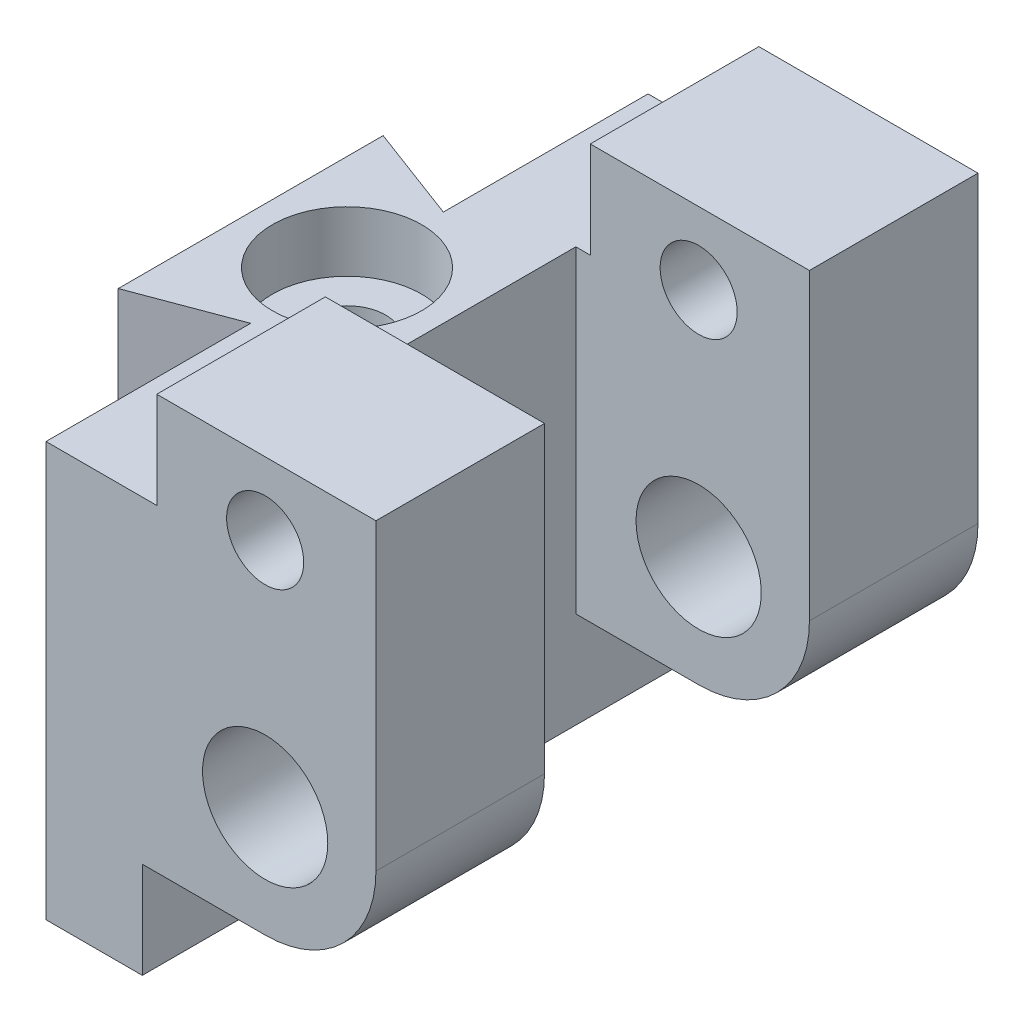
ISO-10303-21;
HEADER;
FILE_DESCRIPTION(('STEP AP214'),'2;1');
FILE_NAME('part.step','',(''),(''),'','','');
FILE_SCHEMA(('AUTOMOTIVE_DESIGN { 1 0 10303 214 1 1 1 1 }'));
ENDSEC;
DATA;
#1=APPLICATION_CONTEXT('core data for automotive mechanical design processes');
#2=APPLICATION_PROTOCOL_DEFINITION('international standard','automotive_design',2000,#1);
#3=PRODUCT_CONTEXT('',#1,'mechanical');
#4=PRODUCT('Part','Part','',(#3));
#5=PRODUCT_RELATED_PRODUCT_CATEGORY('part','',(#4));
#6=PRODUCT_DEFINITION_FORMATION('','',#4);
#7=PRODUCT_DEFINITION_CONTEXT('part definition',#1,'design');
#8=PRODUCT_DEFINITION('design','',#6,#7);
#9=PRODUCT_DEFINITION_SHAPE('','',#8);
#10=(LENGTH_UNIT() NAMED_UNIT(*) SI_UNIT(.MILLI.,.METRE.));
#11=(NAMED_UNIT(*) PLANE_ANGLE_UNIT() SI_UNIT($,.RADIAN.));
#12=(NAMED_UNIT(*) SI_UNIT($,.STERADIAN.) SOLID_ANGLE_UNIT());
#13=UNCERTAINTY_MEASURE_WITH_UNIT(LENGTH_MEASURE(1.E-05),#10,'distance_accuracy_value','');
#14=(GEOMETRIC_REPRESENTATION_CONTEXT(3) GLOBAL_UNCERTAINTY_ASSIGNED_CONTEXT((#13)) GLOBAL_UNIT_ASSIGNED_CONTEXT((#10,
#11,#12)) REPRESENTATION_CONTEXT('',''));
#15=CARTESIAN_POINT('',(0.,0.,0.));
#16=DIRECTION('',(0.,0.,1.));
#17=DIRECTION('',(1.,0.,0.));
#18=AXIS2_PLACEMENT_3D('',#15,#16,#17);
#19=CARTESIAN_POINT('',(-9.10000000000002,25.65,12.5));
#20=DIRECTION('',(0.,-1.,0.));
#21=DIRECTION('',(1.,0.,0.));
#22=AXIS2_PLACEMENT_3D('',#19,#20,#21);
#23=CYLINDRICAL_SURFACE('',#22,1.6);
#24=CARTESIAN_POINT('',(-9.10000000000001,0.649999999999994,12.5));
#25=DIRECTION('',(0.,1.,0.));
#26=DIRECTION('',(-1.,0.,0.));
#27=AXIS2_PLACEMENT_3D('',#24,#25,#26);
#28=CIRCLE('',#27,1.6);
#29=CARTESIAN_POINT('',(-10.7,0.649999999999994,12.5));
#30=VERTEX_POINT('',#29);
#31=EDGE_CURVE('E301',#30,#30,#28,.T.);
#32=ORIENTED_EDGE('',*,*,#31,.F.);
#33=EDGE_LOOP('',(#32));
#34=FACE_BOUND('',#33,.T.);
#35=CARTESIAN_POINT('',(-9.10000000000001,6.1,12.5));
#36=DIRECTION('',(0.,1.,0.));
#37=DIRECTION('',(0.,0.,1.));
#38=AXIS2_PLACEMENT_3D('',#35,#36,#37);
#39=CIRCLE('',#38,1.6);
#40=CARTESIAN_POINT('',(-9.10000000000001,6.1,14.1));
#41=VERTEX_POINT('',#40);
#42=EDGE_CURVE('E39',#41,#41,#39,.F.);
#43=ORIENTED_EDGE('',*,*,#42,.F.);
#44=EDGE_LOOP('',(#43));
#45=FACE_BOUND('',#44,.T.);
#46=ADVANCED_FACE('F35',(#34,#45),#23,.F.);
#47=CARTESIAN_POINT('',(4.6,11.6,-15.1211772028503));
#48=DIRECTION('',(1.,0.,0.));
#49=DIRECTION('',(0.,1.,0.));
#50=AXIS2_PLACEMENT_3D('',#47,#48,#49);
#51=PLANE('',#50);
#52=DIRECTION('',(0.,-1.,0.));
#53=VECTOR('',#52,1.);
#54=CARTESIAN_POINT('',(4.6,11.6,0.));
#55=LINE('',#54,#53);
#56=CARTESIAN_POINT('',(4.6,12.6,0.));
#57=VERTEX_POINT('',#56);
#58=CARTESIAN_POINT('',(4.6,0.,0.));
#59=VERTEX_POINT('',#58);
#60=EDGE_CURVE('E274',#57,#59,#55,.T.);
#61=ORIENTED_EDGE('',*,*,#60,.F.);
#62=DIRECTION('',(0.,0.,-1.));
#63=VECTOR('',#62,1.);
#64=CARTESIAN_POINT('',(4.6,12.6,7.));
#65=LINE('',#64,#63);
#66=CARTESIAN_POINT('',(4.6,12.6,7.));
#67=VERTEX_POINT('',#66);
#68=EDGE_CURVE('E231',#67,#57,#65,.T.);
#69=ORIENTED_EDGE('',*,*,#68,.F.);
#70=DIRECTION('',(0.,-1.,0.));
#71=VECTOR('',#70,1.);
#72=CARTESIAN_POINT('',(4.6,11.6,7.));
#73=LINE('',#72,#71);
#74=CARTESIAN_POINT('',(4.6,0.,7.));
#75=VERTEX_POINT('',#74);
#76=EDGE_CURVE('E429',#67,#75,#73,.T.);
#77=ORIENTED_EDGE('',*,*,#76,.T.);
#78=DIRECTION('',(0.,0.,1.));
#79=VECTOR('',#78,1.);
#80=CARTESIAN_POINT('',(4.6,0.,-15.1211772028503));
#81=LINE('',#80,#79);
#82=EDGE_CURVE('E277',#59,#75,#81,.T.);
#83=ORIENTED_EDGE('',*,*,#82,.F.);
#84=EDGE_LOOP('',(#61,#69,#77,#83));
#85=FACE_BOUND('',#84,.T.);
#86=ADVANCED_FACE('F460',(#85),#51,.T.);
#87=CARTESIAN_POINT('',(4.6,0.,18.));
#88=VERTEX_POINT('',#87);
#89=CARTESIAN_POINT('',(4.6,0.,25.));
#90=VERTEX_POINT('',#89);
#91=EDGE_CURVE('E279',#88,#90,#81,.T.);
#92=ORIENTED_EDGE('',*,*,#91,.F.);
#93=DIRECTION('',(0.,1.,0.));
#94=VECTOR('',#93,1.);
#95=CARTESIAN_POINT('',(4.6,11.6,18.));
#96=LINE('',#95,#94);
#97=CARTESIAN_POINT('',(4.6,12.6,18.));
#98=VERTEX_POINT('',#97);
#99=EDGE_CURVE('E421',#88,#98,#96,.T.);
#100=ORIENTED_EDGE('',*,*,#99,.T.);
#101=DIRECTION('',(0.,0.,-1.));
#102=VECTOR('',#101,1.);
#103=CARTESIAN_POINT('',(4.6,12.6,25.));
#104=LINE('',#103,#102);
#105=CARTESIAN_POINT('',(4.6,12.6,25.));
#106=VERTEX_POINT('',#105);
#107=EDGE_CURVE('E245',#106,#98,#104,.T.);
#108=ORIENTED_EDGE('',*,*,#107,.F.);
#109=DIRECTION('',(0.,1.,0.));
#110=VECTOR('',#109,1.);
#111=CARTESIAN_POINT('',(4.6,11.6,25.));
#112=LINE('',#111,#110);
#113=EDGE_CURVE('E273',#90,#106,#112,.T.);
#114=ORIENTED_EDGE('',*,*,#113,.F.);
#115=EDGE_LOOP('',(#92,#100,#108,#114));
#116=FACE_BOUND('',#115,.T.);
#117=ADVANCED_FACE('F498',(#116),#51,.T.);
#118=CARTESIAN_POINT('',(-5.1,8.6,25.));
#119=DIRECTION('',(-1.,0.,0.));
#120=DIRECTION('',(0.,-1.,0.));
#121=AXIS2_PLACEMENT_3D('',#118,#119,#120);
#122=PLANE('',#121);
#123=DIRECTION('',(0.,0.,-1.));
#124=VECTOR('',#123,1.);
#125=CARTESIAN_POINT('',(-5.1,-8.6,25.));
#126=LINE('',#125,#124);
#127=CARTESIAN_POINT('',(-5.1,-8.6,25.));
#128=VERTEX_POINT('',#127);
#129=CARTESIAN_POINT('',(-5.1,-8.6,0.));
#130=VERTEX_POINT('',#129);
#131=EDGE_CURVE('E415',#128,#130,#126,.T.);
#132=ORIENTED_EDGE('',*,*,#131,.T.);
#133=DIRECTION('',(0.,1.,0.));
#134=VECTOR('',#133,1.);
#135=CARTESIAN_POINT('',(-5.1,-4.6,0.));
#136=LINE('',#135,#134);
#137=CARTESIAN_POINT('',(-5.1,-4.6,0.));
#138=VERTEX_POINT('',#137);
#139=EDGE_CURVE('E394',#130,#138,#136,.T.);
#140=ORIENTED_EDGE('',*,*,#139,.T.);
#141=DIRECTION('',(0.,0.,-1.));
#142=VECTOR('',#141,1.);
#143=CARTESIAN_POINT('',(-5.1,-4.6,25.));
#144=LINE('',#143,#142);
#145=CARTESIAN_POINT('',(-5.1,-4.6,7.));
#146=VERTEX_POINT('',#145);
#147=EDGE_CURVE('E411',#146,#138,#144,.T.);
#148=ORIENTED_EDGE('',*,*,#147,.F.);
#149=DIRECTION('',(0.,1.,0.));
#150=VECTOR('',#149,1.);
#151=CARTESIAN_POINT('',(-5.10000000000001,-20.4,7.));
#152=LINE('',#151,#150);
#153=CARTESIAN_POINT('',(-5.1,8.6,7.));
#154=VERTEX_POINT('',#153);
#155=EDGE_CURVE('E349',#146,#154,#152,.T.);
#156=ORIENTED_EDGE('',*,*,#155,.T.);
#157=DIRECTION('',(0.,0.,1.));
#158=VECTOR('',#157,1.);
#159=CARTESIAN_POINT('',(-5.1,8.6,25.));
#160=LINE('',#159,#158);
#161=CARTESIAN_POINT('',(-5.1,8.6,18.));
#162=VERTEX_POINT('',#161);
#163=EDGE_CURVE('E270',#154,#162,#160,.T.);
#164=ORIENTED_EDGE('',*,*,#163,.T.);
#165=DIRECTION('',(0.,1.,0.));
#166=VECTOR('',#165,1.);
#167=CARTESIAN_POINT('',(-5.1,-20.4,18.));
#168=LINE('',#167,#166);
#169=CARTESIAN_POINT('',(-5.1,-4.6,18.));
#170=VERTEX_POINT('',#169);
#171=EDGE_CURVE('E341',#170,#162,#168,.T.);
#172=ORIENTED_EDGE('',*,*,#171,.F.);
#173=CARTESIAN_POINT('',(-5.1,-4.6,25.));
#174=VERTEX_POINT('',#173);
#175=EDGE_CURVE('E412',#174,#170,#144,.T.);
#176=ORIENTED_EDGE('',*,*,#175,.F.);
#177=DIRECTION('',(0.,1.,0.));
#178=VECTOR('',#177,1.);
#179=CARTESIAN_POINT('',(-5.1,-4.6,25.));
#180=LINE('',#179,#178);
#181=EDGE_CURVE('E379',#128,#174,#180,.T.);
#182=ORIENTED_EDGE('',*,*,#181,.F.);
#183=EDGE_LOOP('',(#132,#140,#148,#156,#164,#172,#176,#182));
#184=FACE_BOUND('',#183,.T.);
#185=DIRECTION('',(0.,0.,1.));
#186=VECTOR('',#185,1.);
#187=CARTESIAN_POINT('',(-5.1,-1.85,9.75000000000001));
#188=LINE('',#187,#186);
#189=CARTESIAN_POINT('',(-5.1,-1.85,9.75000000000001));
#190=VERTEX_POINT('',#189);
#191=CARTESIAN_POINT('',(-5.1,-1.85,15.25));
#192=VERTEX_POINT('',#191);
#193=EDGE_CURVE('E324',#190,#192,#188,.T.);
#194=ORIENTED_EDGE('',*,*,#193,.T.);
#195=DIRECTION('',(0.,1.,0.));
#196=VECTOR('',#195,1.);
#197=CARTESIAN_POINT('',(-5.1,-1.85,15.25));
#198=LINE('',#197,#196);
#199=CARTESIAN_POINT('',(-5.10000000000001,0.649999999999996,15.25));
#200=VERTEX_POINT('',#199);
#201=EDGE_CURVE('E327',#192,#200,#198,.T.);
#202=ORIENTED_EDGE('',*,*,#201,.T.);
#203=DIRECTION('',(0.,0.,1.));
#204=VECTOR('',#203,1.);
#205=CARTESIAN_POINT('',(-5.10000000000001,0.649999999999996,9.75000000000001));
#206=LINE('',#205,#204);
#207=CARTESIAN_POINT('',(-5.1,0.649999999999996,9.75));
#208=VERTEX_POINT('',#207);
#209=EDGE_CURVE('E314',#208,#200,#206,.T.);
#210=ORIENTED_EDGE('',*,*,#209,.F.);
#211=DIRECTION('',(0.,1.,0.));
#212=VECTOR('',#211,1.);
#213=CARTESIAN_POINT('',(-5.1,-1.85,9.75000000000001));
#214=LINE('',#213,#212);
#215=EDGE_CURVE('E330',#190,#208,#214,.T.);
#216=ORIENTED_EDGE('',*,*,#215,.F.);
#217=EDGE_LOOP('',(#194,#202,#210,#216));
#218=FACE_BOUND('',#217,.T.);
#219=ADVANCED_FACE('F443',(#184,#218),#122,.F.);
#220=CARTESIAN_POINT('',(-9.1,8.6,25.));
#221=DIRECTION('',(1.,0.,0.));
#222=DIRECTION('',(0.,0.,-1.));
#223=AXIS2_PLACEMENT_3D('',#220,#221,#222);
#224=PLANE('',#223);
#225=DIRECTION('',(0.,1.,0.));
#226=VECTOR('',#225,1.);
#227=CARTESIAN_POINT('',(-9.10000000000001,-17.5442719099992,16.5));
#228=LINE('',#227,#226);
#229=CARTESIAN_POINT('',(-9.1,-8.6,16.5));
#230=VERTEX_POINT('',#229);
#231=CARTESIAN_POINT('',(-9.1,8.6,16.5));
#232=VERTEX_POINT('',#231);
#233=EDGE_CURVE('E342',#230,#232,#228,.T.);
#234=ORIENTED_EDGE('',*,*,#233,.F.);
#235=DIRECTION('',(0.,0.,-1.));
#236=VECTOR('',#235,1.);
#237=CARTESIAN_POINT('',(-9.1,-8.6,25.));
#238=LINE('',#237,#236);
#239=CARTESIAN_POINT('',(-9.1,-8.6,25.));
#240=VERTEX_POINT('',#239);
#241=EDGE_CURVE('E418',#240,#230,#238,.T.);
#242=ORIENTED_EDGE('',*,*,#241,.F.);
#243=DIRECTION('',(0.,-1.,0.));
#244=VECTOR('',#243,1.);
#245=CARTESIAN_POINT('',(-9.1,8.6,25.));
#246=LINE('',#245,#244);
#247=CARTESIAN_POINT('',(-9.1,8.6,25.));
#248=VERTEX_POINT('',#247);
#249=EDGE_CURVE('E374',#248,#240,#246,.T.);
#250=ORIENTED_EDGE('',*,*,#249,.F.);
#251=DIRECTION('',(0.,0.,-1.));
#252=VECTOR('',#251,1.);
#253=CARTESIAN_POINT('',(-9.1,8.6,25.));
#254=LINE('',#253,#252);
#255=EDGE_CURVE('E404',#248,#232,#254,.T.);
#256=ORIENTED_EDGE('',*,*,#255,.T.);
#257=EDGE_LOOP('',(#234,#242,#250,#256));
#258=FACE_BOUND('',#257,.T.);
#259=ADVANCED_FACE('F484',(#258),#224,.F.);
#260=CARTESIAN_POINT('',(0.,-4.6,25.));
#261=DIRECTION('',(0.,1.,0.));
#262=DIRECTION('',(-1.,0.,0.));
#263=AXIS2_PLACEMENT_3D('',#260,#261,#262);
#264=PLANE('',#263);
#265=DIRECTION('',(0.,0.,-1.));
#266=VECTOR('',#265,1.);
#267=CARTESIAN_POINT('',(0.,-4.6,25.));
#268=LINE('',#267,#266);
#269=CARTESIAN_POINT('',(0.,-4.6,7.));
#270=VERTEX_POINT('',#269);
#271=CARTESIAN_POINT('',(0.,-4.6,0.));
#272=VERTEX_POINT('',#271);
#273=EDGE_CURVE('E407',#270,#272,#268,.T.);
#274=ORIENTED_EDGE('',*,*,#273,.F.);
#275=DIRECTION('',(-1.,0.,0.));
#276=VECTOR('',#275,1.);
#277=CARTESIAN_POINT('',(0.,-4.6,7.));
#278=LINE('',#277,#276);
#279=EDGE_CURVE('E364',#270,#146,#278,.T.);
#280=ORIENTED_EDGE('',*,*,#279,.T.);
#281=ORIENTED_EDGE('',*,*,#147,.T.);
#282=DIRECTION('',(1.,0.,0.));
#283=VECTOR('',#282,1.);
#284=CARTESIAN_POINT('',(0.,-4.6,0.));
#285=LINE('',#284,#283);
#286=EDGE_CURVE('E397',#138,#272,#285,.T.);
#287=ORIENTED_EDGE('',*,*,#286,.T.);
#288=EDGE_LOOP('',(#274,#280,#281,#287));
#289=FACE_BOUND('',#288,.T.);
#290=ADVANCED_FACE('F453',(#289),#264,.F.);
#291=CARTESIAN_POINT('',(0.,0.,25.));
#292=DIRECTION('',(0.,0.,-1.));
#293=DIRECTION('',(-1.,0.,0.));
#294=AXIS2_PLACEMENT_3D('',#291,#292,#293);
#295=CYLINDRICAL_SURFACE('',#294,4.6);
#296=CARTESIAN_POINT('',(0.,0.,0.));
#297=DIRECTION('',(0.,0.,1.));
#298=DIRECTION('',(1.,0.,0.));
#299=AXIS2_PLACEMENT_3D('',#296,#297,#298);
#300=CIRCLE('',#299,4.6);
#301=EDGE_CURVE('E400',#272,#59,#300,.T.);
#302=ORIENTED_EDGE('',*,*,#301,.T.);
#303=ORIENTED_EDGE('',*,*,#82,.T.);
#304=CARTESIAN_POINT('',(0.,0.,7.));
#305=DIRECTION('',(0.,0.,-1.));
#306=DIRECTION('',(-1.,0.,0.));
#307=AXIS2_PLACEMENT_3D('',#304,#305,#306);
#308=CIRCLE('',#307,4.6);
#309=EDGE_CURVE('E362',#75,#270,#308,.T.);
#310=ORIENTED_EDGE('',*,*,#309,.T.);
#311=ORIENTED_EDGE('',*,*,#273,.T.);
#312=EDGE_LOOP('',(#302,#303,#310,#311));
#313=FACE_BOUND('',#312,.T.);
#314=ADVANCED_FACE('F457',(#313),#295,.T.);
#315=CARTESIAN_POINT('',(0.,0.,25.));
#316=DIRECTION('',(0.,0.,-1.));
#317=DIRECTION('',(-1.,0.,0.));
#318=AXIS2_PLACEMENT_3D('',#315,#316,#317);
#319=CYLINDRICAL_SURFACE('',#318,2.6);
#320=CARTESIAN_POINT('',(0.,0.,7.));
#321=DIRECTION('',(0.,0.,-1.));
#322=DIRECTION('',(-1.,0.,0.));
#323=AXIS2_PLACEMENT_3D('',#320,#321,#322);
#324=CIRCLE('',#323,2.6);
#325=CARTESIAN_POINT('',(-2.6,0.,7.));
#326=VERTEX_POINT('',#325);
#327=EDGE_CURVE('E361',#326,#326,#324,.T.);
#328=ORIENTED_EDGE('',*,*,#327,.F.);
#329=EDGE_LOOP('',(#328));
#330=FACE_BOUND('',#329,.T.);
#331=CARTESIAN_POINT('',(0.,0.,0.));
#332=DIRECTION('',(0.,0.,1.));
#333=DIRECTION('',(1.,0.,0.));
#334=AXIS2_PLACEMENT_3D('',#331,#332,#333);
#335=CIRCLE('',#334,2.6);
#336=CARTESIAN_POINT('',(2.6,0.,0.));
#337=VERTEX_POINT('',#336);
#338=EDGE_CURVE('E367',#337,#337,#335,.T.);
#339=ORIENTED_EDGE('',*,*,#338,.F.);
#340=EDGE_LOOP('',(#339));
#341=FACE_BOUND('',#340,.T.);
#342=ADVANCED_FACE('F519',(#330,#341),#319,.F.);
#343=CARTESIAN_POINT('',(0.,0.,25.));
#344=DIRECTION('',(0.,0.,1.));
#345=DIRECTION('',(1.,0.,0.));
#346=AXIS2_PLACEMENT_3D('',#343,#344,#345);
#347=PLANE('',#346);
#348=DIRECTION('',(0.,1.,0.));
#349=VECTOR('',#348,1.);
#350=CARTESIAN_POINT('',(-4.5,11.6,25.));
#351=LINE('',#350,#349);
#352=CARTESIAN_POINT('',(-4.5,8.6,25.));
#353=VERTEX_POINT('',#352);
#354=CARTESIAN_POINT('',(-4.5,12.6,25.));
#355=VERTEX_POINT('',#354);
#356=EDGE_CURVE('E254',#353,#355,#351,.T.);
#357=ORIENTED_EDGE('',*,*,#356,.F.);
#358=DIRECTION('',(-1.,0.,0.));
#359=VECTOR('',#358,1.);
#360=CARTESIAN_POINT('',(-9.1,8.6,25.));
#361=LINE('',#360,#359);
#362=EDGE_CURVE('E386',#353,#248,#361,.T.);
#363=ORIENTED_EDGE('',*,*,#362,.T.);
#364=ORIENTED_EDGE('',*,*,#249,.T.);
#365=DIRECTION('',(1.,0.,0.));
#366=VECTOR('',#365,1.);
#367=CARTESIAN_POINT('',(-9.1,-8.6,25.));
#368=LINE('',#367,#366);
#369=EDGE_CURVE('E377',#240,#128,#368,.T.);
#370=ORIENTED_EDGE('',*,*,#369,.T.);
#371=ORIENTED_EDGE('',*,*,#181,.T.);
#372=DIRECTION('',(1.,0.,0.));
#373=VECTOR('',#372,1.);
#374=CARTESIAN_POINT('',(0.,-4.6,25.));
#375=LINE('',#374,#373);
#376=CARTESIAN_POINT('',(0.,-4.6,25.));
#377=VERTEX_POINT('',#376);
#378=EDGE_CURVE('E381',#174,#377,#375,.T.);
#379=ORIENTED_EDGE('',*,*,#378,.T.);
#380=CARTESIAN_POINT('',(0.,0.,25.));
#381=DIRECTION('',(0.,0.,1.));
#382=DIRECTION('',(1.,0.,0.));
#383=AXIS2_PLACEMENT_3D('',#380,#381,#382);
#384=CIRCLE('',#383,4.6);
#385=EDGE_CURVE('E383',#377,#90,#384,.T.);
#386=ORIENTED_EDGE('',*,*,#385,.T.);
#387=ORIENTED_EDGE('',*,*,#113,.T.);
#388=DIRECTION('',(1.,0.,0.));
#389=VECTOR('',#388,1.);
#390=CARTESIAN_POINT('',(-4.5,12.6,25.));
#391=LINE('',#390,#389);
#392=EDGE_CURVE('E242',#355,#106,#391,.T.);
#393=ORIENTED_EDGE('',*,*,#392,.F.);
#394=EDGE_LOOP('',(#357,#363,#364,#370,#371,#379,#386,#387,#393));
#395=FACE_BOUND('',#394,.T.);
#396=CARTESIAN_POINT('',(0.,9.6,25.));
#397=DIRECTION('',(0.,0.,1.));
#398=DIRECTION('',(1.,0.,0.));
#399=AXIS2_PLACEMENT_3D('',#396,#397,#398);
#400=CIRCLE('',#399,1.6);
#401=CARTESIAN_POINT('',(1.6,9.6,25.));
#402=VERTEX_POINT('',#401);
#403=EDGE_CURVE('E216',#402,#402,#400,.T.);
#404=ORIENTED_EDGE('',*,*,#403,.F.);
#405=EDGE_LOOP('',(#404));
#406=FACE_BOUND('',#405,.T.);
#407=CARTESIAN_POINT('',(0.,0.,25.));
#408=DIRECTION('',(0.,0.,1.));
#409=DIRECTION('',(1.,0.,0.));
#410=AXIS2_PLACEMENT_3D('',#407,#408,#409);
#411=CIRCLE('',#410,2.6);
#412=CARTESIAN_POINT('',(2.6,0.,25.));
#413=VERTEX_POINT('',#412);
#414=EDGE_CURVE('E368',#413,#413,#411,.T.);
#415=ORIENTED_EDGE('',*,*,#414,.F.);
#416=EDGE_LOOP('',(#415));
#417=FACE_BOUND('',#416,.T.);
#418=ADVANCED_FACE('F491',(#395,#406,#417),#347,.T.);
#419=CARTESIAN_POINT('',(0.,0.,0.));
#420=DIRECTION('',(0.,0.,1.));
#421=DIRECTION('',(1.,0.,0.));
#422=AXIS2_PLACEMENT_3D('',#419,#420,#421);
#423=PLANE('',#422);
#424=CARTESIAN_POINT('',(0.,9.6,0.));
#425=DIRECTION('',(0.,0.,1.));
#426=DIRECTION('',(1.,0.,0.));
#427=AXIS2_PLACEMENT_3D('',#424,#425,#426);
#428=CIRCLE('',#427,1.6);
#429=CARTESIAN_POINT('',(1.6,9.6,0.));
#430=VERTEX_POINT('',#429);
#431=EDGE_CURVE('E267',#430,#430,#428,.T.);
#432=ORIENTED_EDGE('',*,*,#431,.T.);
#433=EDGE_LOOP('',(#432));
#434=FACE_BOUND('',#433,.T.);
#435=DIRECTION('',(-1.,0.,0.));
#436=VECTOR('',#435,1.);
#437=CARTESIAN_POINT('',(-9.1,8.6,0.));
#438=LINE('',#437,#436);
#439=CARTESIAN_POINT('',(-4.5,8.6,0.));
#440=VERTEX_POINT('',#439);
#441=CARTESIAN_POINT('',(-9.1,8.6,0.));
#442=VERTEX_POINT('',#441);
#443=EDGE_CURVE('E212',#440,#442,#438,.T.);
#444=ORIENTED_EDGE('',*,*,#443,.F.);
#445=DIRECTION('',(0.,1.,0.));
#446=VECTOR('',#445,1.);
#447=CARTESIAN_POINT('',(-4.5,0.,0.));
#448=LINE('',#447,#446);
#449=CARTESIAN_POINT('',(-4.5,12.6,0.));
#450=VERTEX_POINT('',#449);
#451=EDGE_CURVE('E204',#440,#450,#448,.T.);
#452=ORIENTED_EDGE('',*,*,#451,.T.);
#453=DIRECTION('',(-1.,0.,0.));
#454=VECTOR('',#453,1.);
#455=CARTESIAN_POINT('',(4.6,12.6,0.));
#456=LINE('',#455,#454);
#457=EDGE_CURVE('E209',#57,#450,#456,.T.);
#458=ORIENTED_EDGE('',*,*,#457,.F.);
#459=ORIENTED_EDGE('',*,*,#60,.T.);
#460=ORIENTED_EDGE('',*,*,#301,.F.);
#461=ORIENTED_EDGE('',*,*,#286,.F.);
#462=ORIENTED_EDGE('',*,*,#139,.F.);
#463=DIRECTION('',(1.,0.,0.));
#464=VECTOR('',#463,1.);
#465=CARTESIAN_POINT('',(-9.1,-8.6,0.));
#466=LINE('',#465,#464);
#467=CARTESIAN_POINT('',(-9.1,-8.6,0.));
#468=VERTEX_POINT('',#467);
#469=EDGE_CURVE('E391',#468,#130,#466,.T.);
#470=ORIENTED_EDGE('',*,*,#469,.F.);
#471=DIRECTION('',(0.,-1.,0.));
#472=VECTOR('',#471,1.);
#473=CARTESIAN_POINT('',(-9.1,8.6,0.));
#474=LINE('',#473,#472);
#475=EDGE_CURVE('E371',#442,#468,#474,.T.);
#476=ORIENTED_EDGE('',*,*,#475,.F.);
#477=EDGE_LOOP('',(#444,#452,#458,#459,#460,#461,#462,#470,#476));
#478=FACE_BOUND('',#477,.T.);
#479=ORIENTED_EDGE('',*,*,#338,.T.);
#480=EDGE_LOOP('',(#479));
#481=FACE_BOUND('',#480,.T.);
#482=ADVANCED_FACE('F206',(#434,#478,#481),#423,.F.);
#483=CARTESIAN_POINT('',(-9.1,-8.6,8.5));
#484=VERTEX_POINT('',#483);
#485=EDGE_CURVE('E417',#484,#468,#238,.T.);
#486=ORIENTED_EDGE('',*,*,#485,.F.);
#487=DIRECTION('',(0.,1.,0.));
#488=VECTOR('',#487,1.);
#489=CARTESIAN_POINT('',(-9.10000000000001,-17.5442719099992,8.5));
#490=LINE('',#489,#488);
#491=CARTESIAN_POINT('',(-9.10000000000001,8.6,8.5));
#492=VERTEX_POINT('',#491);
#493=EDGE_CURVE('E344',#484,#492,#490,.T.);
#494=ORIENTED_EDGE('',*,*,#493,.T.);
#495=EDGE_CURVE('E388',#492,#442,#254,.T.);
#496=ORIENTED_EDGE('',*,*,#495,.T.);
#497=ORIENTED_EDGE('',*,*,#475,.T.);
#498=EDGE_LOOP('',(#486,#494,#496,#497));
#499=FACE_BOUND('',#498,.T.);
#500=ADVANCED_FACE('F37',(#499),#224,.F.);
#501=CARTESIAN_POINT('',(-9.1,-8.6,25.));
#502=DIRECTION('',(0.,1.,0.));
#503=DIRECTION('',(0.,0.,1.));
#504=AXIS2_PLACEMENT_3D('',#501,#502,#503);
#505=PLANE('',#504);
#506=CARTESIAN_POINT('',(-9.1,-8.6,12.5));
#507=DIRECTION('',(0.,-1.,0.));
#508=DIRECTION('',(1.,0.,0.));
#509=AXIS2_PLACEMENT_3D('',#506,#507,#508);
#510=CIRCLE('',#509,1.6);
#511=CARTESIAN_POINT('',(-7.5,-8.6,12.5));
#512=VERTEX_POINT('',#511);
#513=EDGE_CURVE('E294',#512,#512,#510,.T.);
#514=ORIENTED_EDGE('',*,*,#513,.F.);
#515=EDGE_LOOP('',(#514));
#516=FACE_BOUND('',#515,.T.);
#517=ORIENTED_EDGE('',*,*,#469,.T.);
#518=ORIENTED_EDGE('',*,*,#131,.F.);
#519=ORIENTED_EDGE('',*,*,#369,.F.);
#520=ORIENTED_EDGE('',*,*,#241,.T.);
#521=DIRECTION('',(0.936329177569045,0.,-0.351123441588391));
#522=VECTOR('',#521,1.);
#523=CARTESIAN_POINT('',(4.3027397260274,-8.6,11.4739726027397));
#524=LINE('',#523,#522);
#525=CARTESIAN_POINT('',(-13.1,-8.60000000000001,18.));
#526=VERTEX_POINT('',#525);
#527=EDGE_CURVE('E290',#526,#230,#524,.T.);
#528=ORIENTED_EDGE('',*,*,#527,.F.);
#529=DIRECTION('',(0.,0.,-1.));
#530=VECTOR('',#529,1.);
#531=CARTESIAN_POINT('',(-13.1,-8.6,16.5));
#532=LINE('',#531,#530);
#533=CARTESIAN_POINT('',(-13.1,-8.60000000000001,7.));
#534=VERTEX_POINT('',#533);
#535=EDGE_CURVE('E339',#526,#534,#532,.T.);
#536=ORIENTED_EDGE('',*,*,#535,.T.);
#537=DIRECTION('',(0.936329177569045,0.,0.351123441588391));
#538=VECTOR('',#537,1.);
#539=CARTESIAN_POINT('',(-3.91643835616438,-8.6,10.4438356164384));
#540=LINE('',#539,#538);
#541=EDGE_CURVE('E276',#534,#484,#540,.T.);
#542=ORIENTED_EDGE('',*,*,#541,.T.);
#543=ORIENTED_EDGE('',*,*,#485,.T.);
#544=EDGE_LOOP('',(#517,#518,#519,#520,#528,#536,#542,#543));
#545=FACE_BOUND('',#544,.T.);
#546=ADVANCED_FACE('F466',(#516,#545),#505,.F.);
#547=ORIENTED_EDGE('',*,*,#175,.T.);
#548=DIRECTION('',(1.,0.,0.));
#549=VECTOR('',#548,1.);
#550=CARTESIAN_POINT('',(0.,-4.6,18.));
#551=LINE('',#550,#549);
#552=CARTESIAN_POINT('',(0.,-4.6,18.));
#553=VERTEX_POINT('',#552);
#554=EDGE_CURVE('E358',#170,#553,#551,.T.);
#555=ORIENTED_EDGE('',*,*,#554,.T.);
#556=EDGE_CURVE('E408',#377,#553,#268,.T.);
#557=ORIENTED_EDGE('',*,*,#556,.F.);
#558=ORIENTED_EDGE('',*,*,#378,.F.);
#559=EDGE_LOOP('',(#547,#555,#557,#558));
#560=FACE_BOUND('',#559,.T.);
#561=ADVANCED_FACE('F503',(#560),#264,.F.);
#562=CARTESIAN_POINT('',(0.,0.,18.));
#563=DIRECTION('',(0.,0.,1.));
#564=DIRECTION('',(1.,0.,0.));
#565=AXIS2_PLACEMENT_3D('',#562,#563,#564);
#566=CIRCLE('',#565,4.6);
#567=EDGE_CURVE('E355',#553,#88,#566,.T.);
#568=ORIENTED_EDGE('',*,*,#567,.T.);
#569=ORIENTED_EDGE('',*,*,#91,.T.);
#570=ORIENTED_EDGE('',*,*,#385,.F.);
#571=ORIENTED_EDGE('',*,*,#556,.T.);
#572=EDGE_LOOP('',(#568,#569,#570,#571));
#573=FACE_BOUND('',#572,.T.);
#574=ADVANCED_FACE('F506',(#573),#295,.T.);
#575=CARTESIAN_POINT('',(-9.1,8.6,25.));
#576=DIRECTION('',(0.,-1.,0.));
#577=DIRECTION('',(0.,0.,-1.));
#578=AXIS2_PLACEMENT_3D('',#575,#576,#577);
#579=PLANE('',#578);
#580=CARTESIAN_POINT('',(-9.10000000000001,8.6,12.5));
#581=DIRECTION('',(0.,1.,0.));
#582=DIRECTION('',(0.,0.,1.));
#583=AXIS2_PLACEMENT_3D('',#580,#581,#582);
#584=CIRCLE('',#583,3.1);
#585=CARTESIAN_POINT('',(-9.10000000000001,8.6,15.6));
#586=VERTEX_POINT('',#585);
#587=EDGE_CURVE('E248',#586,#586,#584,.T.);
#588=ORIENTED_EDGE('',*,*,#587,.F.);
#589=EDGE_LOOP('',(#588));
#590=FACE_BOUND('',#589,.T.);
#591=ORIENTED_EDGE('',*,*,#443,.T.);
#592=ORIENTED_EDGE('',*,*,#495,.F.);
#593=DIRECTION('',(-0.936329177569045,0.,-0.351123441588391));
#594=VECTOR('',#593,1.);
#595=CARTESIAN_POINT('',(-3.91643835616438,8.6,10.4438356164384));
#596=LINE('',#595,#594);
#597=CARTESIAN_POINT('',(-13.1,8.6,7.));
#598=VERTEX_POINT('',#597);
#599=EDGE_CURVE('E287',#492,#598,#596,.T.);
#600=ORIENTED_EDGE('',*,*,#599,.T.);
#601=DIRECTION('',(0.,0.,1.));
#602=VECTOR('',#601,1.);
#603=CARTESIAN_POINT('',(-13.1,8.60000000000001,16.5));
#604=LINE('',#603,#602);
#605=CARTESIAN_POINT('',(-13.1,8.6,18.));
#606=VERTEX_POINT('',#605);
#607=EDGE_CURVE('E338',#598,#606,#604,.T.);
#608=ORIENTED_EDGE('',*,*,#607,.T.);
#609=DIRECTION('',(-0.936329177569045,0.,0.351123441588391));
#610=VECTOR('',#609,1.);
#611=CARTESIAN_POINT('',(4.30273972602739,8.6,11.4739726027397));
#612=LINE('',#611,#610);
#613=EDGE_CURVE('E291',#232,#606,#612,.T.);
#614=ORIENTED_EDGE('',*,*,#613,.F.);
#615=ORIENTED_EDGE('',*,*,#255,.F.);
#616=ORIENTED_EDGE('',*,*,#362,.F.);
#617=DIRECTION('',(0.,0.,1.));
#618=VECTOR('',#617,1.);
#619=CARTESIAN_POINT('',(-4.5,8.6,-8.00000000000001));
#620=LINE('',#619,#618);
#621=CARTESIAN_POINT('',(-4.5,8.6,18.));
#622=VERTEX_POINT('',#621);
#623=EDGE_CURVE('E51',#622,#353,#620,.T.);
#624=ORIENTED_EDGE('',*,*,#623,.F.);
#625=DIRECTION('',(1.,0.,0.));
#626=VECTOR('',#625,1.);
#627=CARTESIAN_POINT('',(-5.1,8.6,18.));
#628=LINE('',#627,#626);
#629=EDGE_CURVE('E44',#162,#622,#628,.T.);
#630=ORIENTED_EDGE('',*,*,#629,.F.);
#631=ORIENTED_EDGE('',*,*,#163,.F.);
#632=DIRECTION('',(-1.,0.,0.));
#633=VECTOR('',#632,1.);
#634=CARTESIAN_POINT('',(-5.10000000000001,8.6,7.));
#635=LINE('',#634,#633);
#636=CARTESIAN_POINT('',(-4.5,8.6,7.));
#637=VERTEX_POINT('',#636);
#638=EDGE_CURVE('E258',#637,#154,#635,.T.);
#639=ORIENTED_EDGE('',*,*,#638,.F.);
#640=EDGE_CURVE('E257',#440,#637,#620,.T.);
#641=ORIENTED_EDGE('',*,*,#640,.F.);
#642=EDGE_LOOP('',(#591,#592,#600,#608,#614,#615,#616,#624,#630,#631,#639,#641));
#643=FACE_BOUND('',#642,.T.);
#644=ADVANCED_FACE('F441',(#590,#643),#579,.F.);
#645=CARTESIAN_POINT('',(0.,0.,18.));
#646=DIRECTION('',(0.,0.,1.));
#647=DIRECTION('',(1.,0.,0.));
#648=AXIS2_PLACEMENT_3D('',#645,#646,#647);
#649=CIRCLE('',#648,2.6);
#650=CARTESIAN_POINT('',(2.6,0.,18.));
#651=VERTEX_POINT('',#650);
#652=EDGE_CURVE('E352',#651,#651,#649,.T.);
#653=ORIENTED_EDGE('',*,*,#652,.F.);
#654=EDGE_LOOP('',(#653));
#655=FACE_BOUND('',#654,.T.);
#656=ORIENTED_EDGE('',*,*,#414,.T.);
#657=EDGE_LOOP('',(#656));
#658=FACE_BOUND('',#657,.T.);
#659=ADVANCED_FACE('F513',(#655,#658),#319,.F.);
#660=CARTESIAN_POINT('',(-5.10000000000001,-20.4,7.));
#661=DIRECTION('',(0.,0.,-1.));
#662=DIRECTION('',(-1.,0.,0.));
#663=AXIS2_PLACEMENT_3D('',#660,#661,#662);
#664=PLANE('',#663);
#665=CARTESIAN_POINT('',(0.,9.6,7.));
#666=DIRECTION('',(0.,0.,-1.));
#667=DIRECTION('',(-1.,0.,0.));
#668=AXIS2_PLACEMENT_3D('',#665,#666,#667);
#669=CIRCLE('',#668,1.6);
#670=CARTESIAN_POINT('',(-1.6,9.6,7.));
#671=VERTEX_POINT('',#670);
#672=EDGE_CURVE('E264',#671,#671,#669,.T.);
#673=ORIENTED_EDGE('',*,*,#672,.T.);
#674=EDGE_LOOP('',(#673));
#675=FACE_BOUND('',#674,.T.);
#676=ORIENTED_EDGE('',*,*,#327,.T.);
#677=EDGE_LOOP('',(#676));
#678=FACE_BOUND('',#677,.T.);
#679=ORIENTED_EDGE('',*,*,#76,.F.);
#680=DIRECTION('',(1.,0.,0.));
#681=VECTOR('',#680,1.);
#682=CARTESIAN_POINT('',(-4.5,12.6,7.));
#683=LINE('',#682,#681);
#684=CARTESIAN_POINT('',(-4.5,12.6,7.));
#685=VERTEX_POINT('',#684);
#686=EDGE_CURVE('E226',#685,#67,#683,.T.);
#687=ORIENTED_EDGE('',*,*,#686,.F.);
#688=DIRECTION('',(0.,-1.,0.));
#689=VECTOR('',#688,1.);
#690=CARTESIAN_POINT('',(-4.5,-20.4,7.));
#691=LINE('',#690,#689);
#692=EDGE_CURVE('E217',#685,#637,#691,.T.);
#693=ORIENTED_EDGE('',*,*,#692,.T.);
#694=ORIENTED_EDGE('',*,*,#638,.T.);
#695=ORIENTED_EDGE('',*,*,#155,.F.);
#696=ORIENTED_EDGE('',*,*,#279,.F.);
#697=ORIENTED_EDGE('',*,*,#309,.F.);
#698=EDGE_LOOP('',(#679,#687,#693,#694,#695,#696,#697));
#699=FACE_BOUND('',#698,.T.);
#700=ADVANCED_FACE('F449',(#675,#678,#699),#664,.F.);
#701=CARTESIAN_POINT('',(-5.1,-20.4,18.));
#702=DIRECTION('',(0.,0.,1.));
#703=DIRECTION('',(1.,0.,0.));
#704=AXIS2_PLACEMENT_3D('',#701,#702,#703);
#705=PLANE('',#704);
#706=CARTESIAN_POINT('',(0.,9.6,18.));
#707=DIRECTION('',(0.,0.,1.));
#708=DIRECTION('',(1.,0.,0.));
#709=AXIS2_PLACEMENT_3D('',#706,#707,#708);
#710=CIRCLE('',#709,1.6);
#711=CARTESIAN_POINT('',(1.6,9.6,18.));
#712=VERTEX_POINT('',#711);
#713=EDGE_CURVE('E263',#712,#712,#710,.T.);
#714=ORIENTED_EDGE('',*,*,#713,.T.);
#715=EDGE_LOOP('',(#714));
#716=FACE_BOUND('',#715,.T.);
#717=ORIENTED_EDGE('',*,*,#629,.T.);
#718=DIRECTION('',(0.,1.,0.));
#719=VECTOR('',#718,1.);
#720=CARTESIAN_POINT('',(-4.5,-20.4,18.));
#721=LINE('',#720,#719);
#722=CARTESIAN_POINT('',(-4.5,12.6,18.));
#723=VERTEX_POINT('',#722);
#724=EDGE_CURVE('E11',#622,#723,#721,.T.);
#725=ORIENTED_EDGE('',*,*,#724,.T.);
#726=DIRECTION('',(-1.,0.,0.));
#727=VECTOR('',#726,1.);
#728=CARTESIAN_POINT('',(4.6,12.6,18.));
#729=LINE('',#728,#727);
#730=EDGE_CURVE('E236',#98,#723,#729,.T.);
#731=ORIENTED_EDGE('',*,*,#730,.F.);
#732=ORIENTED_EDGE('',*,*,#99,.F.);
#733=ORIENTED_EDGE('',*,*,#567,.F.);
#734=ORIENTED_EDGE('',*,*,#554,.F.);
#735=ORIENTED_EDGE('',*,*,#171,.T.);
#736=EDGE_LOOP('',(#717,#725,#731,#732,#733,#734,#735));
#737=FACE_BOUND('',#736,.T.);
#738=ORIENTED_EDGE('',*,*,#652,.T.);
#739=EDGE_LOOP('',(#738));
#740=FACE_BOUND('',#739,.T.);
#741=ADVANCED_FACE('F435',(#716,#737,#740),#705,.F.);
#742=CARTESIAN_POINT('',(-13.1,-17.5442719099992,16.5));
#743=DIRECTION('',(-1.,0.,0.));
#744=DIRECTION('',(0.,-1.,0.));
#745=AXIS2_PLACEMENT_3D('',#742,#743,#744);
#746=PLANE('',#745);
#747=ORIENTED_EDGE('',*,*,#535,.F.);
#748=DIRECTION('',(0.,-1.,0.));
#749=VECTOR('',#748,1.);
#750=CARTESIAN_POINT('',(-13.1,12.8720018726588,18.));
#751=LINE('',#750,#749);
#752=EDGE_CURVE('E295',#606,#526,#751,.T.);
#753=ORIENTED_EDGE('',*,*,#752,.F.);
#754=ORIENTED_EDGE('',*,*,#607,.F.);
#755=DIRECTION('',(0.,-1.,0.));
#756=VECTOR('',#755,1.);
#757=CARTESIAN_POINT('',(-13.1,12.8720018726588,7.));
#758=LINE('',#757,#756);
#759=EDGE_CURVE('E284',#598,#534,#758,.T.);
#760=ORIENTED_EDGE('',*,*,#759,.T.);
#761=EDGE_LOOP('',(#747,#753,#754,#760));
#762=FACE_BOUND('',#761,.T.);
#763=ADVANCED_FACE('F475',(#762),#746,.T.);
#764=CARTESIAN_POINT('',(-7.01228675972854,-1.85,15.25));
#765=DIRECTION('',(0.,0.,-1.));
#766=DIRECTION('',(-1.,0.,0.));
#767=AXIS2_PLACEMENT_3D('',#764,#765,#766);
#768=PLANE('',#767);
#769=ORIENTED_EDGE('',*,*,#201,.F.);
#770=DIRECTION('',(-1.,0.,0.));
#771=VECTOR('',#770,1.);
#772=CARTESIAN_POINT('',(-5.1,-1.85,15.25));
#773=LINE('',#772,#771);
#774=CARTESIAN_POINT('',(-10.6877132402715,-1.85000000000001,15.25));
#775=VERTEX_POINT('',#774);
#776=EDGE_CURVE('E316',#192,#775,#773,.T.);
#777=ORIENTED_EDGE('',*,*,#776,.T.);
#778=DIRECTION('',(0.,1.,0.));
#779=VECTOR('',#778,1.);
#780=CARTESIAN_POINT('',(-10.6877132402715,-1.85000000000001,15.25));
#781=LINE('',#780,#779);
#782=CARTESIAN_POINT('',(-10.6877132402715,0.649999999999994,15.25));
#783=VERTEX_POINT('',#782);
#784=EDGE_CURVE('E336',#775,#783,#781,.T.);
#785=ORIENTED_EDGE('',*,*,#784,.T.);
#786=DIRECTION('',(-1.,0.,0.));
#787=VECTOR('',#786,1.);
#788=CARTESIAN_POINT('',(-5.10000000000001,0.649999999999996,15.25));
#789=LINE('',#788,#787);
#790=EDGE_CURVE('E305',#200,#783,#789,.T.);
#791=ORIENTED_EDGE('',*,*,#790,.F.);
#792=EDGE_LOOP('',(#769,#777,#785,#791));
#793=FACE_BOUND('',#792,.T.);
#794=ADVANCED_FACE('F576',(#793),#768,.T.);
#795=CARTESIAN_POINT('',(-10.6877132402715,-1.85000000000001,15.25));
#796=DIRECTION('',(0.866025403784438,0.,-0.5));
#797=DIRECTION('',(-0.5,0.,-0.866025403784439));
#798=AXIS2_PLACEMENT_3D('',#795,#796,#797);
#799=PLANE('',#798);
#800=ORIENTED_EDGE('',*,*,#784,.F.);
#801=DIRECTION('',(-0.5,0.,-0.866025403784438));
#802=VECTOR('',#801,1.);
#803=CARTESIAN_POINT('',(-10.6877132402715,-1.85000000000001,15.25));
#804=LINE('',#803,#802);
#805=CARTESIAN_POINT('',(-12.275426480543,-1.85000000000001,12.5));
#806=VERTEX_POINT('',#805);
#807=EDGE_CURVE('E318',#775,#806,#804,.T.);
#808=ORIENTED_EDGE('',*,*,#807,.T.);
#809=DIRECTION('',(0.,1.,0.));
#810=VECTOR('',#809,1.);
#811=CARTESIAN_POINT('',(-12.275426480543,-1.85000000000001,12.5));
#812=LINE('',#811,#810);
#813=CARTESIAN_POINT('',(-12.275426480543,0.649999999999993,12.5));
#814=VERTEX_POINT('',#813);
#815=EDGE_CURVE('E334',#806,#814,#812,.T.);
#816=ORIENTED_EDGE('',*,*,#815,.T.);
#817=DIRECTION('',(-0.5,0.,-0.866025403784438));
#818=VECTOR('',#817,1.);
#819=CARTESIAN_POINT('',(-10.6877132402715,0.649999999999994,15.25));
#820=LINE('',#819,#818);
#821=EDGE_CURVE('E308',#783,#814,#820,.T.);
#822=ORIENTED_EDGE('',*,*,#821,.F.);
#823=EDGE_LOOP('',(#800,#808,#816,#822));
#824=FACE_BOUND('',#823,.T.);
#825=ADVANCED_FACE('F579',(#824),#799,.T.);
#826=CARTESIAN_POINT('',(-12.275426480543,-1.85000000000001,12.5));
#827=DIRECTION('',(0.866025403784439,0.,0.5));
#828=DIRECTION('',(0.5,0.,-0.866025403784439));
#829=AXIS2_PLACEMENT_3D('',#826,#827,#828);
#830=PLANE('',#829);
#831=ORIENTED_EDGE('',*,*,#815,.F.);
#832=DIRECTION('',(0.5,0.,-0.866025403784439));
#833=VECTOR('',#832,1.);
#834=CARTESIAN_POINT('',(-12.275426480543,-1.85000000000001,12.5));
#835=LINE('',#834,#833);
#836=CARTESIAN_POINT('',(-10.6877132402715,-1.85000000000001,9.75000000000001));
#837=VERTEX_POINT('',#836);
#838=EDGE_CURVE('E320',#806,#837,#835,.T.);
#839=ORIENTED_EDGE('',*,*,#838,.T.);
#840=DIRECTION('',(0.,1.,0.));
#841=VECTOR('',#840,1.);
#842=CARTESIAN_POINT('',(-10.6877132402715,-1.85000000000001,9.75000000000001));
#843=LINE('',#842,#841);
#844=CARTESIAN_POINT('',(-10.6877132402715,0.649999999999994,9.75000000000001));
#845=VERTEX_POINT('',#844);
#846=EDGE_CURVE('E332',#837,#845,#843,.T.);
#847=ORIENTED_EDGE('',*,*,#846,.T.);
#848=DIRECTION('',(0.5,0.,-0.866025403784439));
#849=VECTOR('',#848,1.);
#850=CARTESIAN_POINT('',(-12.275426480543,0.649999999999993,12.5));
#851=LINE('',#850,#849);
#852=EDGE_CURVE('E311',#814,#845,#851,.T.);
#853=ORIENTED_EDGE('',*,*,#852,.F.);
#854=EDGE_LOOP('',(#831,#839,#847,#853));
#855=FACE_BOUND('',#854,.T.);
#856=ADVANCED_FACE('F583',(#855),#830,.T.);
#857=CARTESIAN_POINT('',(-7.01228675972854,-1.85,9.75));
#858=DIRECTION('',(0.,0.,1.));
#859=DIRECTION('',(1.,0.,0.));
#860=AXIS2_PLACEMENT_3D('',#857,#858,#859);
#861=PLANE('',#860);
#862=ORIENTED_EDGE('',*,*,#846,.F.);
#863=DIRECTION('',(1.,0.,0.));
#864=VECTOR('',#863,1.);
#865=CARTESIAN_POINT('',(-10.6877132402715,-1.85000000000001,9.75000000000001));
#866=LINE('',#865,#864);
#867=EDGE_CURVE('E322',#837,#190,#866,.T.);
#868=ORIENTED_EDGE('',*,*,#867,.T.);
#869=ORIENTED_EDGE('',*,*,#215,.T.);
#870=DIRECTION('',(1.,0.,0.));
#871=VECTOR('',#870,1.);
#872=CARTESIAN_POINT('',(-10.6877132402715,0.649999999999994,9.75000000000001));
#873=LINE('',#872,#871);
#874=EDGE_CURVE('E59',#845,#208,#873,.T.);
#875=ORIENTED_EDGE('',*,*,#874,.F.);
#876=EDGE_LOOP('',(#862,#868,#869,#875));
#877=FACE_BOUND('',#876,.T.);
#878=ADVANCED_FACE('F587',(#877),#861,.T.);
#879=CARTESIAN_POINT('',(0.,-1.85,0.));
#880=DIRECTION('',(0.,1.,0.));
#881=DIRECTION('',(-1.,0.,0.));
#882=AXIS2_PLACEMENT_3D('',#879,#880,#881);
#883=PLANE('',#882);
#884=CARTESIAN_POINT('',(-9.10000000000001,-1.85,12.5));
#885=DIRECTION('',(0.,1.,0.));
#886=DIRECTION('',(-1.,0.,0.));
#887=AXIS2_PLACEMENT_3D('',#884,#885,#886);
#888=CIRCLE('',#887,1.6);
#889=CARTESIAN_POINT('',(-10.7,-1.85,12.5));
#890=VERTEX_POINT('',#889);
#891=EDGE_CURVE('E302',#890,#890,#888,.T.);
#892=ORIENTED_EDGE('',*,*,#891,.F.);
#893=EDGE_LOOP('',(#892));
#894=FACE_BOUND('',#893,.T.);
#895=ORIENTED_EDGE('',*,*,#776,.F.);
#896=ORIENTED_EDGE('',*,*,#193,.F.);
#897=ORIENTED_EDGE('',*,*,#867,.F.);
#898=ORIENTED_EDGE('',*,*,#838,.F.);
#899=ORIENTED_EDGE('',*,*,#807,.F.);
#900=EDGE_LOOP('',(#895,#896,#897,#898,#899));
#901=FACE_BOUND('',#900,.T.);
#902=ADVANCED_FACE('F539',(#894,#901),#883,.T.);
#903=CARTESIAN_POINT('',(0.,0.649999999999999,0.));
#904=DIRECTION('',(0.,1.,0.));
#905=DIRECTION('',(-1.,0.,0.));
#906=AXIS2_PLACEMENT_3D('',#903,#904,#905);
#907=PLANE('',#906);
#908=ORIENTED_EDGE('',*,*,#31,.T.);
#909=EDGE_LOOP('',(#908));
#910=FACE_BOUND('',#909,.T.);
#911=ORIENTED_EDGE('',*,*,#790,.T.);
#912=ORIENTED_EDGE('',*,*,#821,.T.);
#913=ORIENTED_EDGE('',*,*,#852,.T.);
#914=ORIENTED_EDGE('',*,*,#874,.T.);
#915=ORIENTED_EDGE('',*,*,#209,.T.);
#916=EDGE_LOOP('',(#911,#912,#913,#914,#915));
#917=FACE_BOUND('',#916,.T.);
#918=ADVANCED_FACE('F533',(#910,#917),#907,.F.);
#919=ORIENTED_EDGE('',*,*,#891,.T.);
#920=EDGE_LOOP('',(#919));
#921=FACE_BOUND('',#920,.T.);
#922=ORIENTED_EDGE('',*,*,#513,.T.);
#923=EDGE_LOOP('',(#922));
#924=FACE_BOUND('',#923,.T.);
#925=ADVANCED_FACE('F523',(#921,#924),#23,.F.);
#926=CARTESIAN_POINT('',(4.30273972602739,12.8720018726588,11.4739726027397));
#927=DIRECTION('',(-0.351123441588391,0.,-0.936329177569045));
#928=DIRECTION('',(-0.936329177569045,0.,0.351123441588391));
#929=AXIS2_PLACEMENT_3D('',#926,#927,#928);
#930=PLANE('',#929);
#931=ORIENTED_EDGE('',*,*,#233,.T.);
#932=ORIENTED_EDGE('',*,*,#613,.T.);
#933=ORIENTED_EDGE('',*,*,#752,.T.);
#934=ORIENTED_EDGE('',*,*,#527,.T.);
#935=EDGE_LOOP('',(#931,#932,#933,#934));
#936=FACE_BOUND('',#935,.T.);
#937=ADVANCED_FACE('F479',(#936),#930,.F.);
#938=CARTESIAN_POINT('',(-3.91643835616438,12.8720018726588,10.4438356164384));
#939=DIRECTION('',(0.351123441588391,0.,-0.936329177569045));
#940=DIRECTION('',(-0.936329177569045,0.,-0.351123441588391));
#941=AXIS2_PLACEMENT_3D('',#938,#939,#940);
#942=PLANE('',#941);
#943=ORIENTED_EDGE('',*,*,#599,.F.);
#944=ORIENTED_EDGE('',*,*,#493,.F.);
#945=ORIENTED_EDGE('',*,*,#541,.F.);
#946=ORIENTED_EDGE('',*,*,#759,.F.);
#947=EDGE_LOOP('',(#943,#944,#945,#946));
#948=FACE_BOUND('',#947,.T.);
#949=ADVANCED_FACE('F473',(#948),#942,.T.);
#950=CARTESIAN_POINT('',(0.,9.6,-2.25000000000001));
#951=DIRECTION('',(0.,0.,1.));
#952=DIRECTION('',(1.,0.,0.));
#953=AXIS2_PLACEMENT_3D('',#950,#951,#952);
#954=CYLINDRICAL_SURFACE('',#953,1.6);
#955=ORIENTED_EDGE('',*,*,#403,.T.);
#956=EDGE_LOOP('',(#955));
#957=FACE_BOUND('',#956,.T.);
#958=ORIENTED_EDGE('',*,*,#713,.F.);
#959=EDGE_LOOP('',(#958));
#960=FACE_BOUND('',#959,.T.);
#961=ADVANCED_FACE('F654',(#957,#960),#954,.F.);
#962=ORIENTED_EDGE('',*,*,#672,.F.);
#963=EDGE_LOOP('',(#962));
#964=FACE_BOUND('',#963,.T.);
#965=ORIENTED_EDGE('',*,*,#431,.F.);
#966=EDGE_LOOP('',(#965));
#967=FACE_BOUND('',#966,.T.);
#968=ADVANCED_FACE('F684',(#964,#967),#954,.F.);
#969=CARTESIAN_POINT('',(-4.5,11.6,-8.00000000000001));
#970=DIRECTION('',(1.,0.,0.));
#971=DIRECTION('',(0.,0.,-1.));
#972=AXIS2_PLACEMENT_3D('',#969,#970,#971);
#973=PLANE('',#972);
#974=ORIENTED_EDGE('',*,*,#623,.T.);
#975=ORIENTED_EDGE('',*,*,#356,.T.);
#976=DIRECTION('',(0.,0.,1.));
#977=VECTOR('',#976,1.);
#978=CARTESIAN_POINT('',(-4.5,12.6,18.));
#979=LINE('',#978,#977);
#980=EDGE_CURVE('E239',#723,#355,#979,.T.);
#981=ORIENTED_EDGE('',*,*,#980,.F.);
#982=ORIENTED_EDGE('',*,*,#724,.F.);
#983=EDGE_LOOP('',(#974,#975,#981,#982));
#984=FACE_BOUND('',#983,.T.);
#985=ADVANCED_FACE('F489',(#984),#973,.F.);
#986=ORIENTED_EDGE('',*,*,#640,.T.);
#987=ORIENTED_EDGE('',*,*,#692,.F.);
#988=DIRECTION('',(0.,0.,1.));
#989=VECTOR('',#988,1.);
#990=CARTESIAN_POINT('',(-4.5,12.6,0.));
#991=LINE('',#990,#989);
#992=EDGE_CURVE('E220',#450,#685,#991,.T.);
#993=ORIENTED_EDGE('',*,*,#992,.F.);
#994=ORIENTED_EDGE('',*,*,#451,.F.);
#995=EDGE_LOOP('',(#986,#987,#993,#994));
#996=FACE_BOUND('',#995,.T.);
#997=ADVANCED_FACE('F221',(#996),#973,.F.);
#998=CARTESIAN_POINT('',(-9.10000000000001,6.1,12.5));
#999=DIRECTION('',(0.,1.,0.));
#1000=DIRECTION('',(0.,0.,1.));
#1001=AXIS2_PLACEMENT_3D('',#998,#999,#1000);
#1002=PLANE('',#1001);
#1003=CARTESIAN_POINT('',(-9.10000000000001,6.1,12.5));
#1004=DIRECTION('',(0.,1.,0.));
#1005=DIRECTION('',(0.,0.,1.));
#1006=AXIS2_PLACEMENT_3D('',#1003,#1004,#1005);
#1007=CIRCLE('',#1006,3.1);
#1008=CARTESIAN_POINT('',(-9.10000000000001,6.1,15.6));
#1009=VERTEX_POINT('',#1008);
#1010=EDGE_CURVE('E249',#1009,#1009,#1007,.T.);
#1011=ORIENTED_EDGE('',*,*,#1010,.T.);
#1012=EDGE_LOOP('',(#1011));
#1013=FACE_BOUND('',#1012,.T.);
#1014=ORIENTED_EDGE('',*,*,#42,.T.);
#1015=EDGE_LOOP('',(#1014));
#1016=FACE_BOUND('',#1015,.T.);
#1017=ADVANCED_FACE('F721',(#1013,#1016),#1002,.T.);
#1018=CARTESIAN_POINT('',(-9.10000000000001,6.1,12.5));
#1019=DIRECTION('',(0.,1.,0.));
#1020=DIRECTION('',(0.,0.,1.));
#1021=AXIS2_PLACEMENT_3D('',#1018,#1019,#1020);
#1022=CYLINDRICAL_SURFACE('',#1021,3.1);
#1023=ORIENTED_EDGE('',*,*,#1010,.F.);
#1024=EDGE_LOOP('',(#1023));
#1025=FACE_BOUND('',#1024,.T.);
#1026=ORIENTED_EDGE('',*,*,#587,.T.);
#1027=EDGE_LOOP('',(#1026));
#1028=FACE_BOUND('',#1027,.T.);
#1029=ADVANCED_FACE('F725',(#1025,#1028),#1022,.F.);
#1030=CARTESIAN_POINT('',(0.,12.6,0.));
#1031=DIRECTION('',(0.,1.,0.));
#1032=DIRECTION('',(0.,0.,1.));
#1033=AXIS2_PLACEMENT_3D('',#1030,#1031,#1032);
#1034=PLANE('',#1033);
#1035=ORIENTED_EDGE('',*,*,#730,.T.);
#1036=ORIENTED_EDGE('',*,*,#980,.T.);
#1037=ORIENTED_EDGE('',*,*,#392,.T.);
#1038=ORIENTED_EDGE('',*,*,#107,.T.);
#1039=EDGE_LOOP('',(#1035,#1036,#1037,#1038));
#1040=FACE_BOUND('',#1039,.T.);
#1041=ADVANCED_FACE('F495',(#1040),#1034,.T.);
#1042=CARTESIAN_POINT('',(0.,12.6,0.));
#1043=DIRECTION('',(0.,1.,0.));
#1044=DIRECTION('',(0.,0.,1.));
#1045=AXIS2_PLACEMENT_3D('',#1042,#1043,#1044);
#1046=PLANE('',#1045);
#1047=ORIENTED_EDGE('',*,*,#457,.T.);
#1048=ORIENTED_EDGE('',*,*,#992,.T.);
#1049=ORIENTED_EDGE('',*,*,#686,.T.);
#1050=ORIENTED_EDGE('',*,*,#68,.T.);
#1051=EDGE_LOOP('',(#1047,#1048,#1049,#1050));
#1052=FACE_BOUND('',#1051,.T.);
#1053=ADVANCED_FACE('F229',(#1052),#1046,.T.);
#1054=CLOSED_SHELL('',(#46,#86,#117,#219,#259,#290,#314,#342,#418,#482,#500,#546,#561,#574,#644,
#659,#700,#741,#763,#794,#825,#856,#878,#902,#918,#925,#937,#949,#961,#968,#985,#997,#1017,
#1029,#1041,#1053));
#1055=MANIFOLD_SOLID_BREP('B2',#1054);
#1056=ADVANCED_BREP_SHAPE_REPRESENTATION('',(#18,#1055),#14);
#1057=SHAPE_DEFINITION_REPRESENTATION(#9,#1056);
ENDSEC;
END-ISO-10303-21;
